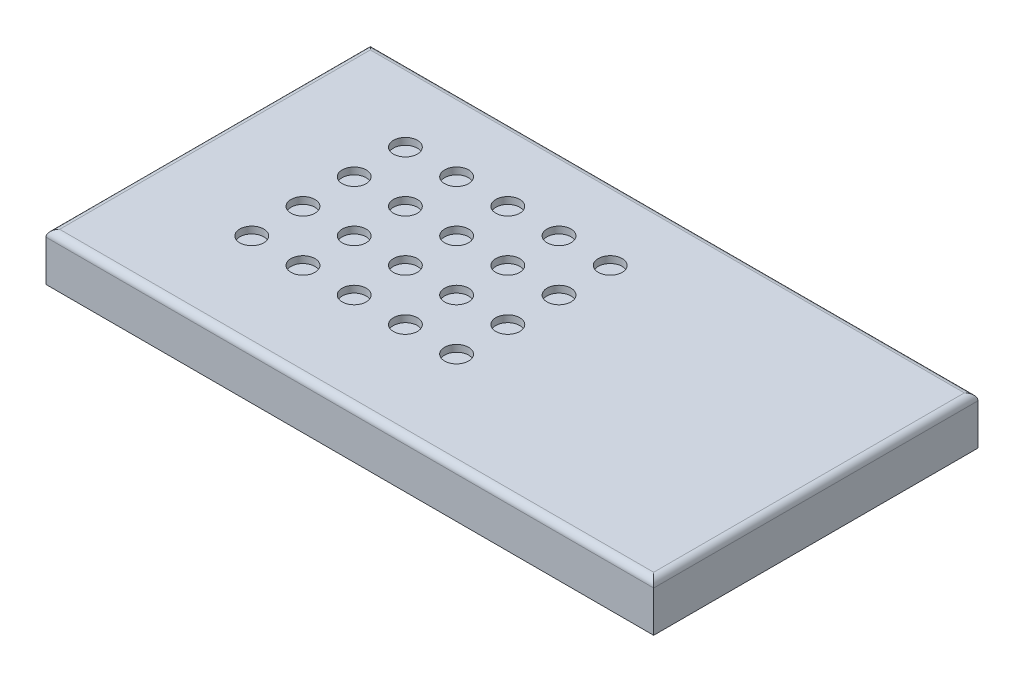
ISO-10303-21;
HEADER;
FILE_DESCRIPTION(('STEP AP214'),'2;1');
FILE_NAME('part.step','',(''),(''),'','','');
FILE_SCHEMA(('AUTOMOTIVE_DESIGN { 1 0 10303 214 1 1 1 1 }'));
ENDSEC;
DATA;
#1=APPLICATION_CONTEXT('core data for automotive mechanical design processes');
#2=APPLICATION_PROTOCOL_DEFINITION('international standard','automotive_design',2000,#1);
#3=PRODUCT_CONTEXT('',#1,'mechanical');
#4=PRODUCT('Part','Part','',(#3));
#5=PRODUCT_RELATED_PRODUCT_CATEGORY('part','',(#4));
#6=PRODUCT_DEFINITION_FORMATION('','',#4);
#7=PRODUCT_DEFINITION_CONTEXT('part definition',#1,'design');
#8=PRODUCT_DEFINITION('design','',#6,#7);
#9=PRODUCT_DEFINITION_SHAPE('','',#8);
#10=(LENGTH_UNIT() NAMED_UNIT(*) SI_UNIT(.MILLI.,.METRE.));
#11=(NAMED_UNIT(*) PLANE_ANGLE_UNIT() SI_UNIT($,.RADIAN.));
#12=(NAMED_UNIT(*) SI_UNIT($,.STERADIAN.) SOLID_ANGLE_UNIT());
#13=UNCERTAINTY_MEASURE_WITH_UNIT(LENGTH_MEASURE(1.E-05),#10,'distance_accuracy_value','');
#14=(GEOMETRIC_REPRESENTATION_CONTEXT(3) GLOBAL_UNCERTAINTY_ASSIGNED_CONTEXT((#13)) GLOBAL_UNIT_ASSIGNED_CONTEXT((#10,
#11,#12)) REPRESENTATION_CONTEXT('',''));
#15=CARTESIAN_POINT('',(0.,0.,0.));
#16=DIRECTION('',(0.,0.,1.));
#17=DIRECTION('',(1.,0.,0.));
#18=AXIS2_PLACEMENT_3D('',#15,#16,#17);
#19=CARTESIAN_POINT('',(0.,2.8,0.));
#20=DIRECTION('',(1.,0.,0.));
#21=DIRECTION('',(0.,0.,-1.));
#22=AXIS2_PLACEMENT_3D('',#19,#20,#21);
#23=PLANE('',#22);
#24=DIRECTION('',(0.,-1.,0.));
#25=VECTOR('',#24,1.);
#26=CARTESIAN_POINT('',(0.,2.8,0.));
#27=LINE('',#26,#25);
#28=CARTESIAN_POINT('',(0.,2.4,0.));
#29=VERTEX_POINT('',#28);
#30=CARTESIAN_POINT('',(0.,0.,0.));
#31=VERTEX_POINT('',#30);
#32=EDGE_CURVE('E88',#29,#31,#27,.T.);
#33=ORIENTED_EDGE('',*,*,#32,.F.);
#34=DIRECTION('',(0.,0.,1.));
#35=VECTOR('',#34,1.);
#36=CARTESIAN_POINT('',(0.,2.4,0.));
#37=LINE('',#36,#35);
#38=CARTESIAN_POINT('',(0.,2.4,-19.));
#39=VERTEX_POINT('',#38);
#40=EDGE_CURVE('E136',#29,#39,#37,.F.);
#41=ORIENTED_EDGE('',*,*,#40,.T.);
#42=DIRECTION('',(0.,-1.,0.));
#43=VECTOR('',#42,1.);
#44=CARTESIAN_POINT('',(0.,2.8,-19.));
#45=LINE('',#44,#43);
#46=CARTESIAN_POINT('',(0.,0.,-19.));
#47=VERTEX_POINT('',#46);
#48=EDGE_CURVE('E110',#39,#47,#45,.T.);
#49=ORIENTED_EDGE('',*,*,#48,.T.);
#50=DIRECTION('',(0.,0.,1.));
#51=VECTOR('',#50,1.);
#52=CARTESIAN_POINT('',(0.,0.,0.));
#53=LINE('',#52,#51);
#54=EDGE_CURVE('E106',#47,#31,#53,.T.);
#55=ORIENTED_EDGE('',*,*,#54,.T.);
#56=EDGE_LOOP('',(#33,#41,#49,#55));
#57=FACE_BOUND('',#56,.T.);
#58=ADVANCED_FACE('F34',(#57),#23,.F.);
#59=CARTESIAN_POINT('',(0.,2.8,0.));
#60=DIRECTION('',(0.,0.,-1.));
#61=DIRECTION('',(-1.,0.,0.));
#62=AXIS2_PLACEMENT_3D('',#59,#60,#61);
#63=PLANE('',#62);
#64=DIRECTION('',(0.,-1.,0.));
#65=VECTOR('',#64,1.);
#66=CARTESIAN_POINT('',(35.6,2.8,0.));
#67=LINE('',#66,#65);
#68=CARTESIAN_POINT('',(35.6,2.4,0.));
#69=VERTEX_POINT('',#68);
#70=CARTESIAN_POINT('',(35.6,0.,0.));
#71=VERTEX_POINT('',#70);
#72=EDGE_CURVE('E100',#69,#71,#67,.T.);
#73=ORIENTED_EDGE('',*,*,#72,.F.);
#74=DIRECTION('',(1.,0.,0.));
#75=VECTOR('',#74,1.);
#76=CARTESIAN_POINT('',(0.,2.4,0.));
#77=LINE('',#76,#75);
#78=EDGE_CURVE('E94',#69,#29,#77,.F.);
#79=ORIENTED_EDGE('',*,*,#78,.T.);
#80=ORIENTED_EDGE('',*,*,#32,.T.);
#81=DIRECTION('',(1.,0.,0.));
#82=VECTOR('',#81,1.);
#83=CARTESIAN_POINT('',(0.,0.,0.));
#84=LINE('',#83,#82);
#85=EDGE_CURVE('E91',#31,#71,#84,.T.);
#86=ORIENTED_EDGE('',*,*,#85,.T.);
#87=EDGE_LOOP('',(#73,#79,#80,#86));
#88=FACE_BOUND('',#87,.T.);
#89=ADVANCED_FACE('F90',(#88),#63,.F.);
#90=CARTESIAN_POINT('',(35.6,2.8,0.));
#91=DIRECTION('',(-1.,0.,0.));
#92=DIRECTION('',(0.,0.,1.));
#93=AXIS2_PLACEMENT_3D('',#90,#91,#92);
#94=PLANE('',#93);
#95=DIRECTION('',(0.,-1.,0.));
#96=VECTOR('',#95,1.);
#97=CARTESIAN_POINT('',(35.6,2.8,-19.));
#98=LINE('',#97,#96);
#99=CARTESIAN_POINT('',(35.6,2.4,-19.));
#100=VERTEX_POINT('',#99);
#101=CARTESIAN_POINT('',(35.6,0.,-19.));
#102=VERTEX_POINT('',#101);
#103=EDGE_CURVE('E125',#100,#102,#98,.T.);
#104=ORIENTED_EDGE('',*,*,#103,.F.);
#105=DIRECTION('',(0.,0.,-1.));
#106=VECTOR('',#105,1.);
#107=CARTESIAN_POINT('',(35.6,2.4,0.));
#108=LINE('',#107,#106);
#109=EDGE_CURVE('E49',#100,#69,#108,.F.);
#110=ORIENTED_EDGE('',*,*,#109,.T.);
#111=ORIENTED_EDGE('',*,*,#72,.T.);
#112=DIRECTION('',(0.,0.,-1.));
#113=VECTOR('',#112,1.);
#114=CARTESIAN_POINT('',(35.6,0.,0.));
#115=LINE('',#114,#113);
#116=EDGE_CURVE('E108',#71,#102,#115,.T.);
#117=ORIENTED_EDGE('',*,*,#116,.T.);
#118=EDGE_LOOP('',(#104,#110,#111,#117));
#119=FACE_BOUND('',#118,.T.);
#120=ADVANCED_FACE('F265',(#119),#94,.F.);
#121=CARTESIAN_POINT('',(0.,2.8,-19.));
#122=DIRECTION('',(0.,0.,1.));
#123=DIRECTION('',(1.,0.,0.));
#124=AXIS2_PLACEMENT_3D('',#121,#122,#123);
#125=PLANE('',#124);
#126=ORIENTED_EDGE('',*,*,#48,.F.);
#127=DIRECTION('',(-1.,0.,0.));
#128=VECTOR('',#127,1.);
#129=CARTESIAN_POINT('',(0.,2.4,-19.));
#130=LINE('',#129,#128);
#131=EDGE_CURVE('E57',#39,#100,#130,.F.);
#132=ORIENTED_EDGE('',*,*,#131,.T.);
#133=ORIENTED_EDGE('',*,*,#103,.T.);
#134=DIRECTION('',(-1.,0.,0.));
#135=VECTOR('',#134,1.);
#136=CARTESIAN_POINT('',(0.,0.,-19.));
#137=LINE('',#136,#135);
#138=EDGE_CURVE('E122',#102,#47,#137,.T.);
#139=ORIENTED_EDGE('',*,*,#138,.T.);
#140=EDGE_LOOP('',(#126,#132,#133,#139));
#141=FACE_BOUND('',#140,.T.);
#142=ADVANCED_FACE('F256',(#141),#125,.F.);
#143=CARTESIAN_POINT('',(0.,2.8,0.));
#144=DIRECTION('',(0.,-1.,0.));
#145=DIRECTION('',(0.,0.,-1.));
#146=AXIS2_PLACEMENT_3D('',#143,#144,#145);
#147=PLANE('',#146);
#148=CARTESIAN_POINT('',(9.36148954356466,2.8,-14.6932415604103));
#149=DIRECTION('',(0.,1.,0.));
#150=DIRECTION('',(0.,0.,1.));
#151=AXIS2_PLACEMENT_3D('',#148,#149,#150);
#152=CIRCLE('',#151,0.70186222526167);
#153=CARTESIAN_POINT('',(9.36148954356466,2.8,-13.9913793351487));
#154=VERTEX_POINT('',#153);
#155=EDGE_CURVE('E812',#154,#154,#152,.T.);
#156=ORIENTED_EDGE('',*,*,#155,.F.);
#157=EDGE_LOOP('',(#156));
#158=FACE_BOUND('',#157,.T.);
#159=CARTESIAN_POINT('',(6.36148954356466,2.8,-14.6932415604103));
#160=DIRECTION('',(0.,1.,0.));
#161=DIRECTION('',(0.,0.,1.));
#162=AXIS2_PLACEMENT_3D('',#159,#160,#161);
#163=CIRCLE('',#162,0.70186222526167);
#164=CARTESIAN_POINT('',(6.36148954356466,2.8,-13.9913793351487));
#165=VERTEX_POINT('',#164);
#166=EDGE_CURVE('E118',#165,#165,#163,.T.);
#167=ORIENTED_EDGE('',*,*,#166,.F.);
#168=EDGE_LOOP('',(#167));
#169=FACE_BOUND('',#168,.T.);
#170=DIRECTION('',(-1.,0.,0.));
#171=VECTOR('',#170,1.);
#172=CARTESIAN_POINT('',(0.,2.8,-18.6));
#173=LINE('',#172,#171);
#174=CARTESIAN_POINT('',(35.2,2.8,-18.6));
#175=VERTEX_POINT('',#174);
#176=CARTESIAN_POINT('',(0.399999999999993,2.8,-18.6));
#177=VERTEX_POINT('',#176);
#178=EDGE_CURVE('E131',#175,#177,#173,.T.);
#179=ORIENTED_EDGE('',*,*,#178,.T.);
#180=DIRECTION('',(0.,0.,1.));
#181=VECTOR('',#180,1.);
#182=CARTESIAN_POINT('',(0.4,2.8,0.));
#183=LINE('',#182,#181);
#184=CARTESIAN_POINT('',(0.4,2.8,-0.4));
#185=VERTEX_POINT('',#184);
#186=EDGE_CURVE('E133',#177,#185,#183,.T.);
#187=ORIENTED_EDGE('',*,*,#186,.T.);
#188=DIRECTION('',(1.,0.,0.));
#189=VECTOR('',#188,1.);
#190=CARTESIAN_POINT('',(0.,2.8,-0.4));
#191=LINE('',#190,#189);
#192=CARTESIAN_POINT('',(35.2,2.8,-0.4));
#193=VERTEX_POINT('',#192);
#194=EDGE_CURVE('E99',#185,#193,#191,.T.);
#195=ORIENTED_EDGE('',*,*,#194,.T.);
#196=DIRECTION('',(0.,0.,-1.));
#197=VECTOR('',#196,1.);
#198=CARTESIAN_POINT('',(35.2,2.8,0.));
#199=LINE('',#198,#197);
#200=EDGE_CURVE('E129',#193,#175,#199,.T.);
#201=ORIENTED_EDGE('',*,*,#200,.T.);
#202=EDGE_LOOP('',(#179,#187,#195,#201));
#203=FACE_BOUND('',#202,.T.);
#204=CARTESIAN_POINT('',(12.3614895435647,2.8,-14.6932415604103));
#205=DIRECTION('',(0.,1.,0.));
#206=DIRECTION('',(0.,0.,1.));
#207=AXIS2_PLACEMENT_3D('',#204,#205,#206);
#208=CIRCLE('',#207,0.70186222526167);
#209=CARTESIAN_POINT('',(12.3614895435647,2.8,-13.9913793351487));
#210=VERTEX_POINT('',#209);
#211=EDGE_CURVE('E141',#210,#210,#208,.T.);
#212=ORIENTED_EDGE('',*,*,#211,.F.);
#213=EDGE_LOOP('',(#212));
#214=FACE_BOUND('',#213,.T.);
#215=CARTESIAN_POINT('',(15.3614895435647,2.8,-14.6932415604103));
#216=DIRECTION('',(0.,1.,0.));
#217=DIRECTION('',(0.,0.,1.));
#218=AXIS2_PLACEMENT_3D('',#215,#216,#217);
#219=CIRCLE('',#218,0.70186222526167);
#220=CARTESIAN_POINT('',(15.3614895435647,2.8,-13.9913793351487));
#221=VERTEX_POINT('',#220);
#222=EDGE_CURVE('E154',#221,#221,#219,.T.);
#223=ORIENTED_EDGE('',*,*,#222,.F.);
#224=EDGE_LOOP('',(#223));
#225=FACE_BOUND('',#224,.T.);
#226=CARTESIAN_POINT('',(18.3614895435647,2.8,-14.6932415604103));
#227=DIRECTION('',(0.,1.,0.));
#228=DIRECTION('',(0.,0.,1.));
#229=AXIS2_PLACEMENT_3D('',#226,#227,#228);
#230=CIRCLE('',#229,0.70186222526167);
#231=CARTESIAN_POINT('',(18.3614895435647,2.8,-13.9913793351487));
#232=VERTEX_POINT('',#231);
#233=EDGE_CURVE('E160',#232,#232,#230,.T.);
#234=ORIENTED_EDGE('',*,*,#233,.F.);
#235=EDGE_LOOP('',(#234));
#236=FACE_BOUND('',#235,.T.);
#237=CARTESIAN_POINT('',(6.36148954356466,2.8,-11.6932415604103));
#238=DIRECTION('',(0.,1.,0.));
#239=DIRECTION('',(0.,0.,1.));
#240=AXIS2_PLACEMENT_3D('',#237,#238,#239);
#241=CIRCLE('',#240,0.70186222526167);
#242=CARTESIAN_POINT('',(6.36148954356466,2.8,-10.9913793351487));
#243=VERTEX_POINT('',#242);
#244=EDGE_CURVE('E166',#243,#243,#241,.T.);
#245=ORIENTED_EDGE('',*,*,#244,.F.);
#246=EDGE_LOOP('',(#245));
#247=FACE_BOUND('',#246,.T.);
#248=CARTESIAN_POINT('',(9.36148954356466,2.8,-11.6932415604103));
#249=DIRECTION('',(0.,1.,0.));
#250=DIRECTION('',(0.,0.,1.));
#251=AXIS2_PLACEMENT_3D('',#248,#249,#250);
#252=CIRCLE('',#251,0.70186222526167);
#253=CARTESIAN_POINT('',(9.36148954356466,2.8,-10.9913793351487));
#254=VERTEX_POINT('',#253);
#255=EDGE_CURVE('E172',#254,#254,#252,.T.);
#256=ORIENTED_EDGE('',*,*,#255,.F.);
#257=EDGE_LOOP('',(#256));
#258=FACE_BOUND('',#257,.T.);
#259=CARTESIAN_POINT('',(12.3614895435647,2.8,-11.6932415604103));
#260=DIRECTION('',(0.,1.,0.));
#261=DIRECTION('',(0.,0.,1.));
#262=AXIS2_PLACEMENT_3D('',#259,#260,#261);
#263=CIRCLE('',#262,0.70186222526167);
#264=CARTESIAN_POINT('',(12.3614895435647,2.8,-10.9913793351487));
#265=VERTEX_POINT('',#264);
#266=EDGE_CURVE('E178',#265,#265,#263,.T.);
#267=ORIENTED_EDGE('',*,*,#266,.F.);
#268=EDGE_LOOP('',(#267));
#269=FACE_BOUND('',#268,.T.);
#270=CARTESIAN_POINT('',(15.3614895435647,2.8,-11.6932415604103));
#271=DIRECTION('',(0.,1.,0.));
#272=DIRECTION('',(0.,0.,1.));
#273=AXIS2_PLACEMENT_3D('',#270,#271,#272);
#274=CIRCLE('',#273,0.70186222526167);
#275=CARTESIAN_POINT('',(15.3614895435647,2.8,-10.9913793351487));
#276=VERTEX_POINT('',#275);
#277=EDGE_CURVE('E184',#276,#276,#274,.T.);
#278=ORIENTED_EDGE('',*,*,#277,.F.);
#279=EDGE_LOOP('',(#278));
#280=FACE_BOUND('',#279,.T.);
#281=CARTESIAN_POINT('',(18.3614895435647,2.8,-11.6932415604103));
#282=DIRECTION('',(0.,1.,0.));
#283=DIRECTION('',(0.,0.,1.));
#284=AXIS2_PLACEMENT_3D('',#281,#282,#283);
#285=CIRCLE('',#284,0.70186222526167);
#286=CARTESIAN_POINT('',(18.3614895435647,2.8,-10.9913793351487));
#287=VERTEX_POINT('',#286);
#288=EDGE_CURVE('E190',#287,#287,#285,.T.);
#289=ORIENTED_EDGE('',*,*,#288,.F.);
#290=EDGE_LOOP('',(#289));
#291=FACE_BOUND('',#290,.T.);
#292=CARTESIAN_POINT('',(6.36148954356466,2.8,-8.69324156041034));
#293=DIRECTION('',(0.,1.,0.));
#294=DIRECTION('',(0.,0.,1.));
#295=AXIS2_PLACEMENT_3D('',#292,#293,#294);
#296=CIRCLE('',#295,0.70186222526167);
#297=CARTESIAN_POINT('',(6.36148954356466,2.8,-7.99137933514867));
#298=VERTEX_POINT('',#297);
#299=EDGE_CURVE('E196',#298,#298,#296,.T.);
#300=ORIENTED_EDGE('',*,*,#299,.F.);
#301=EDGE_LOOP('',(#300));
#302=FACE_BOUND('',#301,.T.);
#303=CARTESIAN_POINT('',(9.36148954356466,2.8,-8.69324156041034));
#304=DIRECTION('',(0.,1.,0.));
#305=DIRECTION('',(0.,0.,1.));
#306=AXIS2_PLACEMENT_3D('',#303,#304,#305);
#307=CIRCLE('',#306,0.70186222526167);
#308=CARTESIAN_POINT('',(9.36148954356466,2.8,-7.99137933514867));
#309=VERTEX_POINT('',#308);
#310=EDGE_CURVE('E202',#309,#309,#307,.T.);
#311=ORIENTED_EDGE('',*,*,#310,.F.);
#312=EDGE_LOOP('',(#311));
#313=FACE_BOUND('',#312,.T.);
#314=CARTESIAN_POINT('',(12.3614895435647,2.8,-8.69324156041034));
#315=DIRECTION('',(0.,1.,0.));
#316=DIRECTION('',(0.,0.,1.));
#317=AXIS2_PLACEMENT_3D('',#314,#315,#316);
#318=CIRCLE('',#317,0.70186222526167);
#319=CARTESIAN_POINT('',(12.3614895435647,2.8,-7.99137933514867));
#320=VERTEX_POINT('',#319);
#321=EDGE_CURVE('E208',#320,#320,#318,.T.);
#322=ORIENTED_EDGE('',*,*,#321,.F.);
#323=EDGE_LOOP('',(#322));
#324=FACE_BOUND('',#323,.T.);
#325=CARTESIAN_POINT('',(15.3614895435647,2.8,-8.69324156041034));
#326=DIRECTION('',(0.,1.,0.));
#327=DIRECTION('',(0.,0.,1.));
#328=AXIS2_PLACEMENT_3D('',#325,#326,#327);
#329=CIRCLE('',#328,0.70186222526167);
#330=CARTESIAN_POINT('',(15.3614895435647,2.8,-7.99137933514867));
#331=VERTEX_POINT('',#330);
#332=EDGE_CURVE('E214',#331,#331,#329,.T.);
#333=ORIENTED_EDGE('',*,*,#332,.F.);
#334=EDGE_LOOP('',(#333));
#335=FACE_BOUND('',#334,.T.);
#336=CARTESIAN_POINT('',(18.3614895435647,2.8,-8.69324156041034));
#337=DIRECTION('',(0.,1.,0.));
#338=DIRECTION('',(0.,0.,1.));
#339=AXIS2_PLACEMENT_3D('',#336,#337,#338);
#340=CIRCLE('',#339,0.70186222526167);
#341=CARTESIAN_POINT('',(18.3614895435647,2.8,-7.99137933514867));
#342=VERTEX_POINT('',#341);
#343=EDGE_CURVE('E220',#342,#342,#340,.T.);
#344=ORIENTED_EDGE('',*,*,#343,.F.);
#345=EDGE_LOOP('',(#344));
#346=FACE_BOUND('',#345,.T.);
#347=CARTESIAN_POINT('',(6.36148954356466,2.8,-5.69324156041034));
#348=DIRECTION('',(0.,1.,0.));
#349=DIRECTION('',(0.,0.,1.));
#350=AXIS2_PLACEMENT_3D('',#347,#348,#349);
#351=CIRCLE('',#350,0.70186222526167);
#352=CARTESIAN_POINT('',(6.36148954356466,2.8,-4.99137933514867));
#353=VERTEX_POINT('',#352);
#354=EDGE_CURVE('E226',#353,#353,#351,.T.);
#355=ORIENTED_EDGE('',*,*,#354,.F.);
#356=EDGE_LOOP('',(#355));
#357=FACE_BOUND('',#356,.T.);
#358=CARTESIAN_POINT('',(9.36148954356466,2.8,-5.69324156041034));
#359=DIRECTION('',(0.,1.,0.));
#360=DIRECTION('',(0.,0.,1.));
#361=AXIS2_PLACEMENT_3D('',#358,#359,#360);
#362=CIRCLE('',#361,0.70186222526167);
#363=CARTESIAN_POINT('',(9.36148954356466,2.8,-4.99137933514867));
#364=VERTEX_POINT('',#363);
#365=EDGE_CURVE('E232',#364,#364,#362,.T.);
#366=ORIENTED_EDGE('',*,*,#365,.F.);
#367=EDGE_LOOP('',(#366));
#368=FACE_BOUND('',#367,.T.);
#369=CARTESIAN_POINT('',(12.3614895435647,2.8,-5.69324156041034));
#370=DIRECTION('',(0.,1.,0.));
#371=DIRECTION('',(0.,0.,1.));
#372=AXIS2_PLACEMENT_3D('',#369,#370,#371);
#373=CIRCLE('',#372,0.70186222526167);
#374=CARTESIAN_POINT('',(12.3614895435647,2.8,-4.99137933514867));
#375=VERTEX_POINT('',#374);
#376=EDGE_CURVE('E238',#375,#375,#373,.T.);
#377=ORIENTED_EDGE('',*,*,#376,.F.);
#378=EDGE_LOOP('',(#377));
#379=FACE_BOUND('',#378,.T.);
#380=CARTESIAN_POINT('',(15.3614895435647,2.8,-5.69324156041034));
#381=DIRECTION('',(0.,1.,0.));
#382=DIRECTION('',(0.,0.,1.));
#383=AXIS2_PLACEMENT_3D('',#380,#381,#382);
#384=CIRCLE('',#383,0.70186222526167);
#385=CARTESIAN_POINT('',(15.3614895435647,2.8,-4.99137933514867));
#386=VERTEX_POINT('',#385);
#387=EDGE_CURVE('E244',#386,#386,#384,.T.);
#388=ORIENTED_EDGE('',*,*,#387,.F.);
#389=EDGE_LOOP('',(#388));
#390=FACE_BOUND('',#389,.T.);
#391=CARTESIAN_POINT('',(18.3614895435647,2.8,-5.69324156041034));
#392=DIRECTION('',(0.,1.,0.));
#393=DIRECTION('',(0.,0.,1.));
#394=AXIS2_PLACEMENT_3D('',#391,#392,#393);
#395=CIRCLE('',#394,0.70186222526167);
#396=CARTESIAN_POINT('',(18.3614895435647,2.8,-4.99137933514867));
#397=VERTEX_POINT('',#396);
#398=EDGE_CURVE('E42',#397,#397,#395,.T.);
#399=ORIENTED_EDGE('',*,*,#398,.F.);
#400=EDGE_LOOP('',(#399));
#401=FACE_BOUND('',#400,.T.);
#402=ADVANCED_FACE('F254',(#158,#169,#203,#214,#225,#236,#247,#258,#269,#280,#291,#302,#313,
#324,#335,#346,#357,#368,#379,#390,#401),#147,.F.);
#403=CARTESIAN_POINT('',(0.,0.,0.));
#404=DIRECTION('',(0.,-1.,0.));
#405=DIRECTION('',(0.,0.,-1.));
#406=AXIS2_PLACEMENT_3D('',#403,#404,#405);
#407=PLANE('',#406);
#408=ORIENTED_EDGE('',*,*,#54,.F.);
#409=ORIENTED_EDGE('',*,*,#138,.F.);
#410=ORIENTED_EDGE('',*,*,#116,.F.);
#411=ORIENTED_EDGE('',*,*,#85,.F.);
#412=EDGE_LOOP('',(#408,#409,#410,#411));
#413=FACE_BOUND('',#412,.T.);
#414=ADVANCED_FACE('F104',(#413),#407,.T.);
#415=CARTESIAN_POINT('',(35.2,2.4,0.));
#416=DIRECTION('',(0.,0.,-1.));
#417=DIRECTION('',(-1.,0.,0.));
#418=AXIS2_PLACEMENT_3D('',#415,#416,#417);
#419=CYLINDRICAL_SURFACE('',#418,0.4);
#420=CARTESIAN_POINT('',(35.2,2.4,-0.4));
#421=DIRECTION('',(0.707106781186547,0.,-0.707106781186548));
#422=DIRECTION('',(0.707106781186548,0.,0.707106781186547));
#423=AXIS2_PLACEMENT_3D('',#420,#421,#422);
#424=ELLIPSE('',#423,0.565685424949238,0.4);
#425=EDGE_CURVE('E115',#69,#193,#424,.F.);
#426=ORIENTED_EDGE('',*,*,#425,.F.);
#427=ORIENTED_EDGE('',*,*,#109,.F.);
#428=CARTESIAN_POINT('',(35.2,2.4,-18.6));
#429=DIRECTION('',(-0.707106781186548,0.,-0.707106781186547));
#430=DIRECTION('',(0.707106781186547,0.,-0.707106781186548));
#431=AXIS2_PLACEMENT_3D('',#428,#429,#430);
#432=ELLIPSE('',#431,0.565685424949238,0.4);
#433=EDGE_CURVE('E112',#175,#100,#432,.T.);
#434=ORIENTED_EDGE('',*,*,#433,.F.);
#435=ORIENTED_EDGE('',*,*,#200,.F.);
#436=EDGE_LOOP('',(#426,#427,#434,#435));
#437=FACE_BOUND('',#436,.T.);
#438=ADVANCED_FACE('F263',(#437),#419,.T.);
#439=CARTESIAN_POINT('',(0.,2.4,-18.6));
#440=DIRECTION('',(-1.,0.,0.));
#441=DIRECTION('',(0.,0.,1.));
#442=AXIS2_PLACEMENT_3D('',#439,#440,#441);
#443=CYLINDRICAL_SURFACE('',#442,0.4);
#444=ORIENTED_EDGE('',*,*,#433,.T.);
#445=ORIENTED_EDGE('',*,*,#131,.F.);
#446=CARTESIAN_POINT('',(0.399999999999993,2.4,-18.6));
#447=DIRECTION('',(-0.707106781186547,0.,0.707106781186548));
#448=DIRECTION('',(-0.707106781186548,0.,-0.707106781186547));
#449=AXIS2_PLACEMENT_3D('',#446,#447,#448);
#450=ELLIPSE('',#449,0.565685424949238,0.4);
#451=EDGE_CURVE('E144',#177,#39,#450,.T.);
#452=ORIENTED_EDGE('',*,*,#451,.F.);
#453=ORIENTED_EDGE('',*,*,#178,.F.);
#454=EDGE_LOOP('',(#444,#445,#452,#453));
#455=FACE_BOUND('',#454,.T.);
#456=ADVANCED_FACE('F286',(#455),#443,.T.);
#457=CARTESIAN_POINT('',(0.,2.4,-0.4));
#458=DIRECTION('',(1.,0.,0.));
#459=DIRECTION('',(0.,0.,-1.));
#460=AXIS2_PLACEMENT_3D('',#457,#458,#459);
#461=CYLINDRICAL_SURFACE('',#460,0.4);
#462=ORIENTED_EDGE('',*,*,#425,.T.);
#463=ORIENTED_EDGE('',*,*,#194,.F.);
#464=CARTESIAN_POINT('',(0.4,2.4,-0.4));
#465=DIRECTION('',(0.707106781186548,0.,0.707106781186547));
#466=DIRECTION('',(0.707106781186547,0.,-0.707106781186548));
#467=AXIS2_PLACEMENT_3D('',#464,#465,#466);
#468=ELLIPSE('',#467,0.565685424949238,0.4);
#469=EDGE_CURVE('E142',#29,#185,#468,.F.);
#470=ORIENTED_EDGE('',*,*,#469,.F.);
#471=ORIENTED_EDGE('',*,*,#78,.F.);
#472=EDGE_LOOP('',(#462,#463,#470,#471));
#473=FACE_BOUND('',#472,.T.);
#474=ADVANCED_FACE('F282',(#473),#461,.T.);
#475=CARTESIAN_POINT('',(0.4,2.4,0.));
#476=DIRECTION('',(0.,0.,1.));
#477=DIRECTION('',(1.,0.,0.));
#478=AXIS2_PLACEMENT_3D('',#475,#476,#477);
#479=CYLINDRICAL_SURFACE('',#478,0.4);
#480=ORIENTED_EDGE('',*,*,#451,.T.);
#481=ORIENTED_EDGE('',*,*,#40,.F.);
#482=ORIENTED_EDGE('',*,*,#469,.T.);
#483=ORIENTED_EDGE('',*,*,#186,.F.);
#484=EDGE_LOOP('',(#480,#481,#482,#483));
#485=FACE_BOUND('',#484,.T.);
#486=ADVANCED_FACE('F278',(#485),#479,.T.);
#487=CARTESIAN_POINT('',(6.36148954356466,2.4,-14.6932415604103));
#488=DIRECTION('',(0.,1.,0.));
#489=DIRECTION('',(0.,0.,1.));
#490=AXIS2_PLACEMENT_3D('',#487,#488,#489);
#491=CYLINDRICAL_SURFACE('',#490,0.70186222526167);
#492=CARTESIAN_POINT('',(6.36148954356466,2.4,-14.6932415604103));
#493=DIRECTION('',(0.,1.,0.));
#494=DIRECTION('',(0.,0.,1.));
#495=AXIS2_PLACEMENT_3D('',#492,#493,#494);
#496=CIRCLE('',#495,0.70186222526167);
#497=CARTESIAN_POINT('',(6.36148954356466,2.4,-13.9913793351487));
#498=VERTEX_POINT('',#497);
#499=EDGE_CURVE('E145',#498,#498,#496,.T.);
#500=ORIENTED_EDGE('',*,*,#499,.F.);
#501=EDGE_LOOP('',(#500));
#502=FACE_BOUND('',#501,.T.);
#503=ORIENTED_EDGE('',*,*,#166,.T.);
#504=EDGE_LOOP('',(#503));
#505=FACE_BOUND('',#504,.T.);
#506=ADVANCED_FACE('F281',(#502,#505),#491,.F.);
#507=CARTESIAN_POINT('',(6.36148954356466,2.4,-14.6932415604103));
#508=DIRECTION('',(0.,1.,0.));
#509=DIRECTION('',(0.,0.,1.));
#510=AXIS2_PLACEMENT_3D('',#507,#508,#509);
#511=PLANE('',#510);
#512=ORIENTED_EDGE('',*,*,#499,.T.);
#513=EDGE_LOOP('',(#512));
#514=FACE_BOUND('',#513,.T.);
#515=ADVANCED_FACE('F589',(#514),#511,.T.);
#516=CARTESIAN_POINT('',(9.36148954356466,2.4,-14.6932415604103));
#517=DIRECTION('',(0.,1.,0.));
#518=DIRECTION('',(0.,0.,1.));
#519=AXIS2_PLACEMENT_3D('',#516,#517,#518);
#520=CYLINDRICAL_SURFACE('',#519,0.70186222526167);
#521=CARTESIAN_POINT('',(9.36148954356466,2.4,-14.6932415604103));
#522=DIRECTION('',(0.,1.,0.));
#523=DIRECTION('',(0.,0.,1.));
#524=AXIS2_PLACEMENT_3D('',#521,#522,#523);
#525=CIRCLE('',#524,0.70186222526167);
#526=CARTESIAN_POINT('',(9.36148954356466,2.4,-13.9913793351487));
#527=VERTEX_POINT('',#526);
#528=EDGE_CURVE('E810',#527,#527,#525,.T.);
#529=ORIENTED_EDGE('',*,*,#528,.F.);
#530=EDGE_LOOP('',(#529));
#531=FACE_BOUND('',#530,.T.);
#532=ORIENTED_EDGE('',*,*,#155,.T.);
#533=EDGE_LOOP('',(#532));
#534=FACE_BOUND('',#533,.T.);
#535=ADVANCED_FACE('F581',(#531,#534),#520,.F.);
#536=CARTESIAN_POINT('',(9.36148954356466,2.4,-14.6932415604103));
#537=DIRECTION('',(0.,1.,0.));
#538=DIRECTION('',(0.,0.,1.));
#539=AXIS2_PLACEMENT_3D('',#536,#537,#538);
#540=PLANE('',#539);
#541=ORIENTED_EDGE('',*,*,#528,.T.);
#542=EDGE_LOOP('',(#541));
#543=FACE_BOUND('',#542,.T.);
#544=ADVANCED_FACE('F302',(#543),#540,.T.);
#545=CARTESIAN_POINT('',(12.3614895435647,2.4,-14.6932415604103));
#546=DIRECTION('',(0.,1.,0.));
#547=DIRECTION('',(0.,0.,1.));
#548=AXIS2_PLACEMENT_3D('',#545,#546,#547);
#549=PLANE('',#548);
#550=CARTESIAN_POINT('',(12.3614895435647,2.4,-14.6932415604103));
#551=DIRECTION('',(0.,1.,0.));
#552=DIRECTION('',(0.,0.,1.));
#553=AXIS2_PLACEMENT_3D('',#550,#551,#552);
#554=CIRCLE('',#553,0.70186222526167);
#555=CARTESIAN_POINT('',(12.3614895435647,2.4,-13.9913793351487));
#556=VERTEX_POINT('',#555);
#557=EDGE_CURVE('E151',#556,#556,#554,.T.);
#558=ORIENTED_EDGE('',*,*,#557,.T.);
#559=EDGE_LOOP('',(#558));
#560=FACE_BOUND('',#559,.T.);
#561=ADVANCED_FACE('F298',(#560),#549,.T.);
#562=CARTESIAN_POINT('',(12.3614895435647,2.4,-14.6932415604103));
#563=DIRECTION('',(0.,1.,0.));
#564=DIRECTION('',(0.,0.,1.));
#565=AXIS2_PLACEMENT_3D('',#562,#563,#564);
#566=CYLINDRICAL_SURFACE('',#565,0.70186222526167);
#567=ORIENTED_EDGE('',*,*,#557,.F.);
#568=EDGE_LOOP('',(#567));
#569=FACE_BOUND('',#568,.T.);
#570=ORIENTED_EDGE('',*,*,#211,.T.);
#571=EDGE_LOOP('',(#570));
#572=FACE_BOUND('',#571,.T.);
#573=ADVANCED_FACE('F294',(#569,#572),#566,.F.);
#574=CARTESIAN_POINT('',(15.3614895435647,2.4,-14.6932415604103));
#575=DIRECTION('',(0.,1.,0.));
#576=DIRECTION('',(0.,0.,1.));
#577=AXIS2_PLACEMENT_3D('',#574,#575,#576);
#578=PLANE('',#577);
#579=CARTESIAN_POINT('',(15.3614895435647,2.4,-14.6932415604103));
#580=DIRECTION('',(0.,1.,0.));
#581=DIRECTION('',(0.,0.,1.));
#582=AXIS2_PLACEMENT_3D('',#579,#580,#581);
#583=CIRCLE('',#582,0.70186222526167);
#584=CARTESIAN_POINT('',(15.3614895435647,2.4,-13.9913793351487));
#585=VERTEX_POINT('',#584);
#586=EDGE_CURVE('E157',#585,#585,#583,.T.);
#587=ORIENTED_EDGE('',*,*,#586,.T.);
#588=EDGE_LOOP('',(#587));
#589=FACE_BOUND('',#588,.T.);
#590=ADVANCED_FACE('F297',(#589),#578,.T.);
#591=CARTESIAN_POINT('',(15.3614895435647,2.4,-14.6932415604103));
#592=DIRECTION('',(0.,1.,0.));
#593=DIRECTION('',(0.,0.,1.));
#594=AXIS2_PLACEMENT_3D('',#591,#592,#593);
#595=CYLINDRICAL_SURFACE('',#594,0.70186222526167);
#596=ORIENTED_EDGE('',*,*,#586,.F.);
#597=EDGE_LOOP('',(#596));
#598=FACE_BOUND('',#597,.T.);
#599=ORIENTED_EDGE('',*,*,#222,.T.);
#600=EDGE_LOOP('',(#599));
#601=FACE_BOUND('',#600,.T.);
#602=ADVANCED_FACE('F304',(#598,#601),#595,.F.);
#603=CARTESIAN_POINT('',(18.3614895435647,2.4,-14.6932415604103));
#604=DIRECTION('',(0.,1.,0.));
#605=DIRECTION('',(0.,0.,1.));
#606=AXIS2_PLACEMENT_3D('',#603,#604,#605);
#607=PLANE('',#606);
#608=CARTESIAN_POINT('',(18.3614895435647,2.4,-14.6932415604103));
#609=DIRECTION('',(0.,1.,0.));
#610=DIRECTION('',(0.,0.,1.));
#611=AXIS2_PLACEMENT_3D('',#608,#609,#610);
#612=CIRCLE('',#611,0.70186222526167);
#613=CARTESIAN_POINT('',(18.3614895435647,2.4,-13.9913793351487));
#614=VERTEX_POINT('',#613);
#615=EDGE_CURVE('E163',#614,#614,#612,.T.);
#616=ORIENTED_EDGE('',*,*,#615,.T.);
#617=EDGE_LOOP('',(#616));
#618=FACE_BOUND('',#617,.T.);
#619=ADVANCED_FACE('F307',(#618),#607,.T.);
#620=CARTESIAN_POINT('',(18.3614895435647,2.4,-14.6932415604103));
#621=DIRECTION('',(0.,1.,0.));
#622=DIRECTION('',(0.,0.,1.));
#623=AXIS2_PLACEMENT_3D('',#620,#621,#622);
#624=CYLINDRICAL_SURFACE('',#623,0.70186222526167);
#625=ORIENTED_EDGE('',*,*,#615,.F.);
#626=EDGE_LOOP('',(#625));
#627=FACE_BOUND('',#626,.T.);
#628=ORIENTED_EDGE('',*,*,#233,.T.);
#629=EDGE_LOOP('',(#628));
#630=FACE_BOUND('',#629,.T.);
#631=ADVANCED_FACE('F312',(#627,#630),#624,.F.);
#632=CARTESIAN_POINT('',(6.36148954356466,2.4,-11.6932415604103));
#633=DIRECTION('',(0.,1.,0.));
#634=DIRECTION('',(0.,0.,1.));
#635=AXIS2_PLACEMENT_3D('',#632,#633,#634);
#636=PLANE('',#635);
#637=CARTESIAN_POINT('',(6.36148954356466,2.4,-11.6932415604103));
#638=DIRECTION('',(0.,1.,0.));
#639=DIRECTION('',(0.,0.,1.));
#640=AXIS2_PLACEMENT_3D('',#637,#638,#639);
#641=CIRCLE('',#640,0.70186222526167);
#642=CARTESIAN_POINT('',(6.36148954356466,2.4,-10.9913793351487));
#643=VERTEX_POINT('',#642);
#644=EDGE_CURVE('E169',#643,#643,#641,.T.);
#645=ORIENTED_EDGE('',*,*,#644,.T.);
#646=EDGE_LOOP('',(#645));
#647=FACE_BOUND('',#646,.T.);
#648=ADVANCED_FACE('F315',(#647),#636,.T.);
#649=CARTESIAN_POINT('',(6.36148954356466,2.4,-11.6932415604103));
#650=DIRECTION('',(0.,1.,0.));
#651=DIRECTION('',(0.,0.,1.));
#652=AXIS2_PLACEMENT_3D('',#649,#650,#651);
#653=CYLINDRICAL_SURFACE('',#652,0.70186222526167);
#654=ORIENTED_EDGE('',*,*,#644,.F.);
#655=EDGE_LOOP('',(#654));
#656=FACE_BOUND('',#655,.T.);
#657=ORIENTED_EDGE('',*,*,#244,.T.);
#658=EDGE_LOOP('',(#657));
#659=FACE_BOUND('',#658,.T.);
#660=ADVANCED_FACE('F320',(#656,#659),#653,.F.);
#661=CARTESIAN_POINT('',(9.36148954356466,2.4,-11.6932415604103));
#662=DIRECTION('',(0.,1.,0.));
#663=DIRECTION('',(0.,0.,1.));
#664=AXIS2_PLACEMENT_3D('',#661,#662,#663);
#665=PLANE('',#664);
#666=CARTESIAN_POINT('',(9.36148954356466,2.4,-11.6932415604103));
#667=DIRECTION('',(0.,1.,0.));
#668=DIRECTION('',(0.,0.,1.));
#669=AXIS2_PLACEMENT_3D('',#666,#667,#668);
#670=CIRCLE('',#669,0.70186222526167);
#671=CARTESIAN_POINT('',(9.36148954356466,2.4,-10.9913793351487));
#672=VERTEX_POINT('',#671);
#673=EDGE_CURVE('E175',#672,#672,#670,.T.);
#674=ORIENTED_EDGE('',*,*,#673,.T.);
#675=EDGE_LOOP('',(#674));
#676=FACE_BOUND('',#675,.T.);
#677=ADVANCED_FACE('F323',(#676),#665,.T.);
#678=CARTESIAN_POINT('',(9.36148954356466,2.4,-11.6932415604103));
#679=DIRECTION('',(0.,1.,0.));
#680=DIRECTION('',(0.,0.,1.));
#681=AXIS2_PLACEMENT_3D('',#678,#679,#680);
#682=CYLINDRICAL_SURFACE('',#681,0.70186222526167);
#683=ORIENTED_EDGE('',*,*,#673,.F.);
#684=EDGE_LOOP('',(#683));
#685=FACE_BOUND('',#684,.T.);
#686=ORIENTED_EDGE('',*,*,#255,.T.);
#687=EDGE_LOOP('',(#686));
#688=FACE_BOUND('',#687,.T.);
#689=ADVANCED_FACE('F328',(#685,#688),#682,.F.);
#690=CARTESIAN_POINT('',(12.3614895435647,2.4,-11.6932415604103));
#691=DIRECTION('',(0.,1.,0.));
#692=DIRECTION('',(0.,0.,1.));
#693=AXIS2_PLACEMENT_3D('',#690,#691,#692);
#694=PLANE('',#693);
#695=CARTESIAN_POINT('',(12.3614895435647,2.4,-11.6932415604103));
#696=DIRECTION('',(0.,1.,0.));
#697=DIRECTION('',(0.,0.,1.));
#698=AXIS2_PLACEMENT_3D('',#695,#696,#697);
#699=CIRCLE('',#698,0.70186222526167);
#700=CARTESIAN_POINT('',(12.3614895435647,2.4,-10.9913793351487));
#701=VERTEX_POINT('',#700);
#702=EDGE_CURVE('E181',#701,#701,#699,.T.);
#703=ORIENTED_EDGE('',*,*,#702,.T.);
#704=EDGE_LOOP('',(#703));
#705=FACE_BOUND('',#704,.T.);
#706=ADVANCED_FACE('F331',(#705),#694,.T.);
#707=CARTESIAN_POINT('',(12.3614895435647,2.4,-11.6932415604103));
#708=DIRECTION('',(0.,1.,0.));
#709=DIRECTION('',(0.,0.,1.));
#710=AXIS2_PLACEMENT_3D('',#707,#708,#709);
#711=CYLINDRICAL_SURFACE('',#710,0.70186222526167);
#712=ORIENTED_EDGE('',*,*,#702,.F.);
#713=EDGE_LOOP('',(#712));
#714=FACE_BOUND('',#713,.T.);
#715=ORIENTED_EDGE('',*,*,#266,.T.);
#716=EDGE_LOOP('',(#715));
#717=FACE_BOUND('',#716,.T.);
#718=ADVANCED_FACE('F336',(#714,#717),#711,.F.);
#719=CARTESIAN_POINT('',(15.3614895435647,2.4,-11.6932415604103));
#720=DIRECTION('',(0.,1.,0.));
#721=DIRECTION('',(0.,0.,1.));
#722=AXIS2_PLACEMENT_3D('',#719,#720,#721);
#723=PLANE('',#722);
#724=CARTESIAN_POINT('',(15.3614895435647,2.4,-11.6932415604103));
#725=DIRECTION('',(0.,1.,0.));
#726=DIRECTION('',(0.,0.,1.));
#727=AXIS2_PLACEMENT_3D('',#724,#725,#726);
#728=CIRCLE('',#727,0.70186222526167);
#729=CARTESIAN_POINT('',(15.3614895435647,2.4,-10.9913793351487));
#730=VERTEX_POINT('',#729);
#731=EDGE_CURVE('E187',#730,#730,#728,.T.);
#732=ORIENTED_EDGE('',*,*,#731,.T.);
#733=EDGE_LOOP('',(#732));
#734=FACE_BOUND('',#733,.T.);
#735=ADVANCED_FACE('F339',(#734),#723,.T.);
#736=CARTESIAN_POINT('',(15.3614895435647,2.4,-11.6932415604103));
#737=DIRECTION('',(0.,1.,0.));
#738=DIRECTION('',(0.,0.,1.));
#739=AXIS2_PLACEMENT_3D('',#736,#737,#738);
#740=CYLINDRICAL_SURFACE('',#739,0.70186222526167);
#741=ORIENTED_EDGE('',*,*,#731,.F.);
#742=EDGE_LOOP('',(#741));
#743=FACE_BOUND('',#742,.T.);
#744=ORIENTED_EDGE('',*,*,#277,.T.);
#745=EDGE_LOOP('',(#744));
#746=FACE_BOUND('',#745,.T.);
#747=ADVANCED_FACE('F344',(#743,#746),#740,.F.);
#748=CARTESIAN_POINT('',(18.3614895435647,2.4,-11.6932415604103));
#749=DIRECTION('',(0.,1.,0.));
#750=DIRECTION('',(0.,0.,1.));
#751=AXIS2_PLACEMENT_3D('',#748,#749,#750);
#752=PLANE('',#751);
#753=CARTESIAN_POINT('',(18.3614895435647,2.4,-11.6932415604103));
#754=DIRECTION('',(0.,1.,0.));
#755=DIRECTION('',(0.,0.,1.));
#756=AXIS2_PLACEMENT_3D('',#753,#754,#755);
#757=CIRCLE('',#756,0.70186222526167);
#758=CARTESIAN_POINT('',(18.3614895435647,2.4,-10.9913793351487));
#759=VERTEX_POINT('',#758);
#760=EDGE_CURVE('E193',#759,#759,#757,.T.);
#761=ORIENTED_EDGE('',*,*,#760,.T.);
#762=EDGE_LOOP('',(#761));
#763=FACE_BOUND('',#762,.T.);
#764=ADVANCED_FACE('F347',(#763),#752,.T.);
#765=CARTESIAN_POINT('',(18.3614895435647,2.4,-11.6932415604103));
#766=DIRECTION('',(0.,1.,0.));
#767=DIRECTION('',(0.,0.,1.));
#768=AXIS2_PLACEMENT_3D('',#765,#766,#767);
#769=CYLINDRICAL_SURFACE('',#768,0.70186222526167);
#770=ORIENTED_EDGE('',*,*,#760,.F.);
#771=EDGE_LOOP('',(#770));
#772=FACE_BOUND('',#771,.T.);
#773=ORIENTED_EDGE('',*,*,#288,.T.);
#774=EDGE_LOOP('',(#773));
#775=FACE_BOUND('',#774,.T.);
#776=ADVANCED_FACE('F352',(#772,#775),#769,.F.);
#777=CARTESIAN_POINT('',(6.36148954356466,2.4,-8.69324156041034));
#778=DIRECTION('',(0.,1.,0.));
#779=DIRECTION('',(0.,0.,1.));
#780=AXIS2_PLACEMENT_3D('',#777,#778,#779);
#781=PLANE('',#780);
#782=CARTESIAN_POINT('',(6.36148954356466,2.4,-8.69324156041034));
#783=DIRECTION('',(0.,1.,0.));
#784=DIRECTION('',(0.,0.,1.));
#785=AXIS2_PLACEMENT_3D('',#782,#783,#784);
#786=CIRCLE('',#785,0.70186222526167);
#787=CARTESIAN_POINT('',(6.36148954356466,2.4,-7.99137933514867));
#788=VERTEX_POINT('',#787);
#789=EDGE_CURVE('E199',#788,#788,#786,.T.);
#790=ORIENTED_EDGE('',*,*,#789,.T.);
#791=EDGE_LOOP('',(#790));
#792=FACE_BOUND('',#791,.T.);
#793=ADVANCED_FACE('F355',(#792),#781,.T.);
#794=CARTESIAN_POINT('',(6.36148954356466,2.4,-8.69324156041034));
#795=DIRECTION('',(0.,1.,0.));
#796=DIRECTION('',(0.,0.,1.));
#797=AXIS2_PLACEMENT_3D('',#794,#795,#796);
#798=CYLINDRICAL_SURFACE('',#797,0.70186222526167);
#799=ORIENTED_EDGE('',*,*,#789,.F.);
#800=EDGE_LOOP('',(#799));
#801=FACE_BOUND('',#800,.T.);
#802=ORIENTED_EDGE('',*,*,#299,.T.);
#803=EDGE_LOOP('',(#802));
#804=FACE_BOUND('',#803,.T.);
#805=ADVANCED_FACE('F360',(#801,#804),#798,.F.);
#806=CARTESIAN_POINT('',(9.36148954356466,2.4,-8.69324156041034));
#807=DIRECTION('',(0.,1.,0.));
#808=DIRECTION('',(0.,0.,1.));
#809=AXIS2_PLACEMENT_3D('',#806,#807,#808);
#810=PLANE('',#809);
#811=CARTESIAN_POINT('',(9.36148954356466,2.4,-8.69324156041034));
#812=DIRECTION('',(0.,1.,0.));
#813=DIRECTION('',(0.,0.,1.));
#814=AXIS2_PLACEMENT_3D('',#811,#812,#813);
#815=CIRCLE('',#814,0.70186222526167);
#816=CARTESIAN_POINT('',(9.36148954356466,2.4,-7.99137933514867));
#817=VERTEX_POINT('',#816);
#818=EDGE_CURVE('E205',#817,#817,#815,.T.);
#819=ORIENTED_EDGE('',*,*,#818,.T.);
#820=EDGE_LOOP('',(#819));
#821=FACE_BOUND('',#820,.T.);
#822=ADVANCED_FACE('F363',(#821),#810,.T.);
#823=CARTESIAN_POINT('',(9.36148954356466,2.4,-8.69324156041034));
#824=DIRECTION('',(0.,1.,0.));
#825=DIRECTION('',(0.,0.,1.));
#826=AXIS2_PLACEMENT_3D('',#823,#824,#825);
#827=CYLINDRICAL_SURFACE('',#826,0.70186222526167);
#828=ORIENTED_EDGE('',*,*,#818,.F.);
#829=EDGE_LOOP('',(#828));
#830=FACE_BOUND('',#829,.T.);
#831=ORIENTED_EDGE('',*,*,#310,.T.);
#832=EDGE_LOOP('',(#831));
#833=FACE_BOUND('',#832,.T.);
#834=ADVANCED_FACE('F368',(#830,#833),#827,.F.);
#835=CARTESIAN_POINT('',(12.3614895435647,2.4,-8.69324156041034));
#836=DIRECTION('',(0.,1.,0.));
#837=DIRECTION('',(0.,0.,1.));
#838=AXIS2_PLACEMENT_3D('',#835,#836,#837);
#839=PLANE('',#838);
#840=CARTESIAN_POINT('',(12.3614895435647,2.4,-8.69324156041034));
#841=DIRECTION('',(0.,1.,0.));
#842=DIRECTION('',(0.,0.,1.));
#843=AXIS2_PLACEMENT_3D('',#840,#841,#842);
#844=CIRCLE('',#843,0.70186222526167);
#845=CARTESIAN_POINT('',(12.3614895435647,2.4,-7.99137933514867));
#846=VERTEX_POINT('',#845);
#847=EDGE_CURVE('E211',#846,#846,#844,.T.);
#848=ORIENTED_EDGE('',*,*,#847,.T.);
#849=EDGE_LOOP('',(#848));
#850=FACE_BOUND('',#849,.T.);
#851=ADVANCED_FACE('F371',(#850),#839,.T.);
#852=CARTESIAN_POINT('',(12.3614895435647,2.4,-8.69324156041034));
#853=DIRECTION('',(0.,1.,0.));
#854=DIRECTION('',(0.,0.,1.));
#855=AXIS2_PLACEMENT_3D('',#852,#853,#854);
#856=CYLINDRICAL_SURFACE('',#855,0.70186222526167);
#857=ORIENTED_EDGE('',*,*,#847,.F.);
#858=EDGE_LOOP('',(#857));
#859=FACE_BOUND('',#858,.T.);
#860=ORIENTED_EDGE('',*,*,#321,.T.);
#861=EDGE_LOOP('',(#860));
#862=FACE_BOUND('',#861,.T.);
#863=ADVANCED_FACE('F376',(#859,#862),#856,.F.);
#864=CARTESIAN_POINT('',(15.3614895435647,2.4,-8.69324156041034));
#865=DIRECTION('',(0.,1.,0.));
#866=DIRECTION('',(0.,0.,1.));
#867=AXIS2_PLACEMENT_3D('',#864,#865,#866);
#868=PLANE('',#867);
#869=CARTESIAN_POINT('',(15.3614895435647,2.4,-8.69324156041034));
#870=DIRECTION('',(0.,1.,0.));
#871=DIRECTION('',(0.,0.,1.));
#872=AXIS2_PLACEMENT_3D('',#869,#870,#871);
#873=CIRCLE('',#872,0.70186222526167);
#874=CARTESIAN_POINT('',(15.3614895435647,2.4,-7.99137933514867));
#875=VERTEX_POINT('',#874);
#876=EDGE_CURVE('E217',#875,#875,#873,.T.);
#877=ORIENTED_EDGE('',*,*,#876,.T.);
#878=EDGE_LOOP('',(#877));
#879=FACE_BOUND('',#878,.T.);
#880=ADVANCED_FACE('F379',(#879),#868,.T.);
#881=CARTESIAN_POINT('',(15.3614895435647,2.4,-8.69324156041034));
#882=DIRECTION('',(0.,1.,0.));
#883=DIRECTION('',(0.,0.,1.));
#884=AXIS2_PLACEMENT_3D('',#881,#882,#883);
#885=CYLINDRICAL_SURFACE('',#884,0.70186222526167);
#886=ORIENTED_EDGE('',*,*,#876,.F.);
#887=EDGE_LOOP('',(#886));
#888=FACE_BOUND('',#887,.T.);
#889=ORIENTED_EDGE('',*,*,#332,.T.);
#890=EDGE_LOOP('',(#889));
#891=FACE_BOUND('',#890,.T.);
#892=ADVANCED_FACE('F384',(#888,#891),#885,.F.);
#893=CARTESIAN_POINT('',(18.3614895435647,2.4,-8.69324156041034));
#894=DIRECTION('',(0.,1.,0.));
#895=DIRECTION('',(0.,0.,1.));
#896=AXIS2_PLACEMENT_3D('',#893,#894,#895);
#897=PLANE('',#896);
#898=CARTESIAN_POINT('',(18.3614895435647,2.4,-8.69324156041034));
#899=DIRECTION('',(0.,1.,0.));
#900=DIRECTION('',(0.,0.,1.));
#901=AXIS2_PLACEMENT_3D('',#898,#899,#900);
#902=CIRCLE('',#901,0.70186222526167);
#903=CARTESIAN_POINT('',(18.3614895435647,2.4,-7.99137933514867));
#904=VERTEX_POINT('',#903);
#905=EDGE_CURVE('E223',#904,#904,#902,.T.);
#906=ORIENTED_EDGE('',*,*,#905,.T.);
#907=EDGE_LOOP('',(#906));
#908=FACE_BOUND('',#907,.T.);
#909=ADVANCED_FACE('F387',(#908),#897,.T.);
#910=CARTESIAN_POINT('',(18.3614895435647,2.4,-8.69324156041034));
#911=DIRECTION('',(0.,1.,0.));
#912=DIRECTION('',(0.,0.,1.));
#913=AXIS2_PLACEMENT_3D('',#910,#911,#912);
#914=CYLINDRICAL_SURFACE('',#913,0.70186222526167);
#915=ORIENTED_EDGE('',*,*,#905,.F.);
#916=EDGE_LOOP('',(#915));
#917=FACE_BOUND('',#916,.T.);
#918=ORIENTED_EDGE('',*,*,#343,.T.);
#919=EDGE_LOOP('',(#918));
#920=FACE_BOUND('',#919,.T.);
#921=ADVANCED_FACE('F392',(#917,#920),#914,.F.);
#922=CARTESIAN_POINT('',(6.36148954356466,2.4,-5.69324156041034));
#923=DIRECTION('',(0.,1.,0.));
#924=DIRECTION('',(0.,0.,1.));
#925=AXIS2_PLACEMENT_3D('',#922,#923,#924);
#926=PLANE('',#925);
#927=CARTESIAN_POINT('',(6.36148954356466,2.4,-5.69324156041034));
#928=DIRECTION('',(0.,1.,0.));
#929=DIRECTION('',(0.,0.,1.));
#930=AXIS2_PLACEMENT_3D('',#927,#928,#929);
#931=CIRCLE('',#930,0.70186222526167);
#932=CARTESIAN_POINT('',(6.36148954356466,2.4,-4.99137933514867));
#933=VERTEX_POINT('',#932);
#934=EDGE_CURVE('E229',#933,#933,#931,.T.);
#935=ORIENTED_EDGE('',*,*,#934,.T.);
#936=EDGE_LOOP('',(#935));
#937=FACE_BOUND('',#936,.T.);
#938=ADVANCED_FACE('F395',(#937),#926,.T.);
#939=CARTESIAN_POINT('',(6.36148954356466,2.4,-5.69324156041034));
#940=DIRECTION('',(0.,1.,0.));
#941=DIRECTION('',(0.,0.,1.));
#942=AXIS2_PLACEMENT_3D('',#939,#940,#941);
#943=CYLINDRICAL_SURFACE('',#942,0.70186222526167);
#944=ORIENTED_EDGE('',*,*,#934,.F.);
#945=EDGE_LOOP('',(#944));
#946=FACE_BOUND('',#945,.T.);
#947=ORIENTED_EDGE('',*,*,#354,.T.);
#948=EDGE_LOOP('',(#947));
#949=FACE_BOUND('',#948,.T.);
#950=ADVANCED_FACE('F400',(#946,#949),#943,.F.);
#951=CARTESIAN_POINT('',(9.36148954356466,2.4,-5.69324156041034));
#952=DIRECTION('',(0.,1.,0.));
#953=DIRECTION('',(0.,0.,1.));
#954=AXIS2_PLACEMENT_3D('',#951,#952,#953);
#955=PLANE('',#954);
#956=CARTESIAN_POINT('',(9.36148954356466,2.4,-5.69324156041034));
#957=DIRECTION('',(0.,1.,0.));
#958=DIRECTION('',(0.,0.,1.));
#959=AXIS2_PLACEMENT_3D('',#956,#957,#958);
#960=CIRCLE('',#959,0.70186222526167);
#961=CARTESIAN_POINT('',(9.36148954356466,2.4,-4.99137933514867));
#962=VERTEX_POINT('',#961);
#963=EDGE_CURVE('E235',#962,#962,#960,.T.);
#964=ORIENTED_EDGE('',*,*,#963,.T.);
#965=EDGE_LOOP('',(#964));
#966=FACE_BOUND('',#965,.T.);
#967=ADVANCED_FACE('F403',(#966),#955,.T.);
#968=CARTESIAN_POINT('',(9.36148954356466,2.4,-5.69324156041034));
#969=DIRECTION('',(0.,1.,0.));
#970=DIRECTION('',(0.,0.,1.));
#971=AXIS2_PLACEMENT_3D('',#968,#969,#970);
#972=CYLINDRICAL_SURFACE('',#971,0.70186222526167);
#973=ORIENTED_EDGE('',*,*,#963,.F.);
#974=EDGE_LOOP('',(#973));
#975=FACE_BOUND('',#974,.T.);
#976=ORIENTED_EDGE('',*,*,#365,.T.);
#977=EDGE_LOOP('',(#976));
#978=FACE_BOUND('',#977,.T.);
#979=ADVANCED_FACE('F408',(#975,#978),#972,.F.);
#980=CARTESIAN_POINT('',(12.3614895435647,2.4,-5.69324156041034));
#981=DIRECTION('',(0.,1.,0.));
#982=DIRECTION('',(0.,0.,1.));
#983=AXIS2_PLACEMENT_3D('',#980,#981,#982);
#984=PLANE('',#983);
#985=CARTESIAN_POINT('',(12.3614895435647,2.4,-5.69324156041034));
#986=DIRECTION('',(0.,1.,0.));
#987=DIRECTION('',(0.,0.,1.));
#988=AXIS2_PLACEMENT_3D('',#985,#986,#987);
#989=CIRCLE('',#988,0.70186222526167);
#990=CARTESIAN_POINT('',(12.3614895435647,2.4,-4.99137933514867));
#991=VERTEX_POINT('',#990);
#992=EDGE_CURVE('E241',#991,#991,#989,.T.);
#993=ORIENTED_EDGE('',*,*,#992,.T.);
#994=EDGE_LOOP('',(#993));
#995=FACE_BOUND('',#994,.T.);
#996=ADVANCED_FACE('F411',(#995),#984,.T.);
#997=CARTESIAN_POINT('',(12.3614895435647,2.4,-5.69324156041034));
#998=DIRECTION('',(0.,1.,0.));
#999=DIRECTION('',(0.,0.,1.));
#1000=AXIS2_PLACEMENT_3D('',#997,#998,#999);
#1001=CYLINDRICAL_SURFACE('',#1000,0.70186222526167);
#1002=ORIENTED_EDGE('',*,*,#992,.F.);
#1003=EDGE_LOOP('',(#1002));
#1004=FACE_BOUND('',#1003,.T.);
#1005=ORIENTED_EDGE('',*,*,#376,.T.);
#1006=EDGE_LOOP('',(#1005));
#1007=FACE_BOUND('',#1006,.T.);
#1008=ADVANCED_FACE('F416',(#1004,#1007),#1001,.F.);
#1009=CARTESIAN_POINT('',(15.3614895435647,2.4,-5.69324156041034));
#1010=DIRECTION('',(0.,1.,0.));
#1011=DIRECTION('',(0.,0.,1.));
#1012=AXIS2_PLACEMENT_3D('',#1009,#1010,#1011);
#1013=PLANE('',#1012);
#1014=CARTESIAN_POINT('',(15.3614895435647,2.4,-5.69324156041034));
#1015=DIRECTION('',(0.,1.,0.));
#1016=DIRECTION('',(0.,0.,1.));
#1017=AXIS2_PLACEMENT_3D('',#1014,#1015,#1016);
#1018=CIRCLE('',#1017,0.70186222526167);
#1019=CARTESIAN_POINT('',(15.3614895435647,2.4,-4.99137933514867));
#1020=VERTEX_POINT('',#1019);
#1021=EDGE_CURVE('E247',#1020,#1020,#1018,.T.);
#1022=ORIENTED_EDGE('',*,*,#1021,.T.);
#1023=EDGE_LOOP('',(#1022));
#1024=FACE_BOUND('',#1023,.T.);
#1025=ADVANCED_FACE('F419',(#1024),#1013,.T.);
#1026=CARTESIAN_POINT('',(15.3614895435647,2.4,-5.69324156041034));
#1027=DIRECTION('',(0.,1.,0.));
#1028=DIRECTION('',(0.,0.,1.));
#1029=AXIS2_PLACEMENT_3D('',#1026,#1027,#1028);
#1030=CYLINDRICAL_SURFACE('',#1029,0.70186222526167);
#1031=ORIENTED_EDGE('',*,*,#1021,.F.);
#1032=EDGE_LOOP('',(#1031));
#1033=FACE_BOUND('',#1032,.T.);
#1034=ORIENTED_EDGE('',*,*,#387,.T.);
#1035=EDGE_LOOP('',(#1034));
#1036=FACE_BOUND('',#1035,.T.);
#1037=ADVANCED_FACE('F424',(#1033,#1036),#1030,.F.);
#1038=CARTESIAN_POINT('',(18.3614895435647,2.4,-5.69324156041034));
#1039=DIRECTION('',(0.,1.,0.));
#1040=DIRECTION('',(0.,0.,1.));
#1041=AXIS2_PLACEMENT_3D('',#1038,#1039,#1040);
#1042=PLANE('',#1041);
#1043=CARTESIAN_POINT('',(18.3614895435647,2.4,-5.69324156041034));
#1044=DIRECTION('',(0.,1.,0.));
#1045=DIRECTION('',(0.,0.,1.));
#1046=AXIS2_PLACEMENT_3D('',#1043,#1044,#1045);
#1047=CIRCLE('',#1046,0.70186222526167);
#1048=CARTESIAN_POINT('',(18.3614895435647,2.4,-4.99137933514867));
#1049=VERTEX_POINT('',#1048);
#1050=EDGE_CURVE('E11',#1049,#1049,#1047,.T.);
#1051=ORIENTED_EDGE('',*,*,#1050,.T.);
#1052=EDGE_LOOP('',(#1051));
#1053=FACE_BOUND('',#1052,.T.);
#1054=ADVANCED_FACE('F36',(#1053),#1042,.T.);
#1055=CARTESIAN_POINT('',(18.3614895435647,2.4,-5.69324156041034));
#1056=DIRECTION('',(0.,1.,0.));
#1057=DIRECTION('',(0.,0.,1.));
#1058=AXIS2_PLACEMENT_3D('',#1055,#1056,#1057);
#1059=CYLINDRICAL_SURFACE('',#1058,0.70186222526167);
#1060=ORIENTED_EDGE('',*,*,#1050,.F.);
#1061=EDGE_LOOP('',(#1060));
#1062=FACE_BOUND('',#1061,.T.);
#1063=ORIENTED_EDGE('',*,*,#398,.T.);
#1064=EDGE_LOOP('',(#1063));
#1065=FACE_BOUND('',#1064,.T.);
#1066=ADVANCED_FACE('F252',(#1062,#1065),#1059,.F.);
#1067=CLOSED_SHELL('',(#58,#89,#120,#142,#402,#414,#438,#456,#474,#486,#506,#515,#535,#544,#561,
#573,#590,#602,#619,#631,#648,#660,#677,#689,#706,#718,#735,#747,#764,#776,#793,#805,#822,#834,
#851,#863,#880,#892,#909,#921,#938,#950,#967,#979,#996,#1008,#1025,#1037,#1054,#1066));
#1068=MANIFOLD_SOLID_BREP('B2',#1067);
#1069=ADVANCED_BREP_SHAPE_REPRESENTATION('',(#18,#1068),#14);
#1070=SHAPE_DEFINITION_REPRESENTATION(#9,#1069);
ENDSEC;
END-ISO-10303-21;
